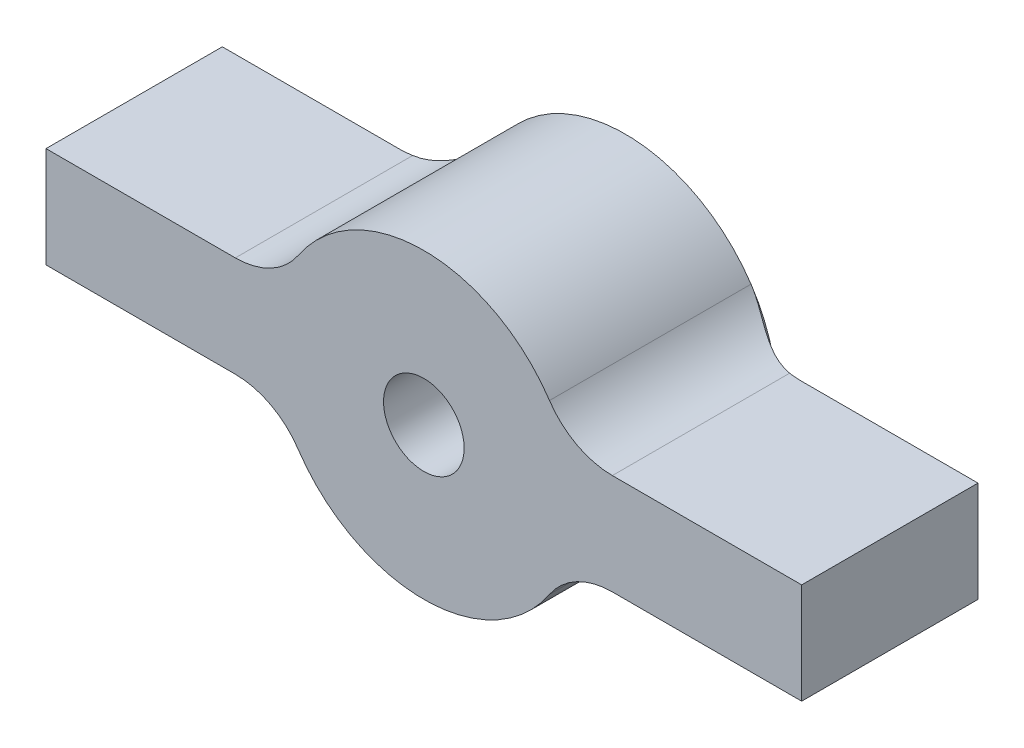
ISO-10303-21;
HEADER;
FILE_DESCRIPTION(('STEP AP214'),'2;1');
FILE_NAME('part.step','',(''),(''),'','','');
FILE_SCHEMA(('AUTOMOTIVE_DESIGN { 1 0 10303 214 1 1 1 1 }'));
ENDSEC;
DATA;
#1=APPLICATION_CONTEXT('core data for automotive mechanical design processes');
#2=APPLICATION_PROTOCOL_DEFINITION('international standard','automotive_design',2000,#1);
#3=PRODUCT_CONTEXT('',#1,'mechanical');
#4=PRODUCT('Part','Part','',(#3));
#5=PRODUCT_RELATED_PRODUCT_CATEGORY('part','',(#4));
#6=PRODUCT_DEFINITION_FORMATION('','',#4);
#7=PRODUCT_DEFINITION_CONTEXT('part definition',#1,'design');
#8=PRODUCT_DEFINITION('design','',#6,#7);
#9=PRODUCT_DEFINITION_SHAPE('','',#8);
#10=(LENGTH_UNIT() NAMED_UNIT(*) SI_UNIT(.MILLI.,.METRE.));
#11=(NAMED_UNIT(*) PLANE_ANGLE_UNIT() SI_UNIT($,.RADIAN.));
#12=(NAMED_UNIT(*) SI_UNIT($,.STERADIAN.) SOLID_ANGLE_UNIT());
#13=UNCERTAINTY_MEASURE_WITH_UNIT(LENGTH_MEASURE(1.E-05),#10,'distance_accuracy_value','');
#14=(GEOMETRIC_REPRESENTATION_CONTEXT(3) GLOBAL_UNCERTAINTY_ASSIGNED_CONTEXT((#13)) GLOBAL_UNIT_ASSIGNED_CONTEXT((#10,
#11,#12)) REPRESENTATION_CONTEXT('',''));
#15=CARTESIAN_POINT('',(0.,0.,0.));
#16=DIRECTION('',(0.,0.,1.));
#17=DIRECTION('',(1.,0.,0.));
#18=AXIS2_PLACEMENT_3D('',#15,#16,#17);
#19=CARTESIAN_POINT('',(4.50028563205647E-11,0.,9.70144103940029E-12));
#20=DIRECTION('',(0.,0.,-1.));
#21=DIRECTION('',(-1.,0.,0.));
#22=AXIS2_PLACEMENT_3D('',#19,#20,#21);
#23=CYLINDRICAL_SURFACE('',#22,6.00000000002839);
#24=CARTESIAN_POINT('',(4.50025882387273E-11,0.,-2.18905432588434));
#25=DIRECTION('',(0.,0.,-1.));
#26=DIRECTION('',(-1.,0.,0.));
#27=AXIS2_PLACEMENT_3D('',#24,#25,#26);
#28=CIRCLE('',#27,6.00000000002839);
#29=CARTESIAN_POINT('',(4.98887651577422,-3.33333333333859,-2.18905432588434));
#30=VERTEX_POINT('',#29);
#31=CARTESIAN_POINT('',(-4.98887651568421,-3.33333333333859,-2.18905432588434));
#32=VERTEX_POINT('',#31);
#33=EDGE_CURVE('E418',#30,#32,#28,.T.);
#34=ORIENTED_EDGE('',*,*,#33,.F.);
#35=DIRECTION('',(0.,0.,-1.));
#36=VECTOR('',#35,1.);
#37=CARTESIAN_POINT('',(4.98887651577422,-3.33333333333859,9.70083007823466E-12));
#38=LINE('',#37,#36);
#39=CARTESIAN_POINT('',(4.98887651577422,-3.33333333333859,5.81094567411566));
#40=VERTEX_POINT('',#39);
#41=EDGE_CURVE('E271',#30,#40,#38,.F.);
#42=ORIENTED_EDGE('',*,*,#41,.T.);
#43=CARTESIAN_POINT('',(4.50035679561667E-11,0.,5.81094567411566));
#44=DIRECTION('',(0.,0.,-1.));
#45=DIRECTION('',(-1.,0.,0.));
#46=AXIS2_PLACEMENT_3D('',#43,#44,#45);
#47=CIRCLE('',#46,6.00000000002839);
#48=CARTESIAN_POINT('',(-4.98887651568421,-3.33333333333859,5.81094567411566));
#49=VERTEX_POINT('',#48);
#50=EDGE_CURVE('E250',#40,#49,#47,.T.);
#51=ORIENTED_EDGE('',*,*,#50,.T.);
#52=DIRECTION('',(0.,0.,-1.));
#53=VECTOR('',#52,1.);
#54=CARTESIAN_POINT('',(-4.98887651568422,-3.33333333333859,9.70205200056593E-12));
#55=LINE('',#54,#53);
#56=EDGE_CURVE('E269',#49,#32,#55,.T.);
#57=ORIENTED_EDGE('',*,*,#56,.T.);
#58=EDGE_LOOP('',(#34,#42,#51,#57));
#59=FACE_BOUND('',#58,.T.);
#60=ADVANCED_FACE('F32',(#59),#23,.T.);
#61=CARTESIAN_POINT('',(4.50030637755283E-11,0.,31.5738213201296));
#62=DIRECTION('',(0.,0.,-1.));
#63=DIRECTION('',(1.,0.,0.));
#64=AXIS2_PLACEMENT_3D('',#61,#62,#63);
#65=SPHERICAL_SURFACE('',#64,34.2918615984689);
#66=CARTESIAN_POINT('',(1.42500000003571,2.46817240076956,31.5738213201296));
#67=DIRECTION('',(0.5,0.866025403784439,0.));
#68=DIRECTION('',(-0.866025403784439,0.5,0.));
#69=AXIS2_PLACEMENT_3D('',#66,#67,#68);
#70=CIRCLE('',#69,34.173224487728);
#71=CARTESIAN_POINT('',(1.86027408755063E-12,3.29089653438432,-2.55976583224159));
#72=VERTEX_POINT('',#71);
#73=CARTESIAN_POINT('',(2.85000000000187,1.64544826719388,-2.55976583224536));
#74=VERTEX_POINT('',#73);
#75=EDGE_CURVE('E11',#72,#74,#70,.F.);
#76=ORIENTED_EDGE('',*,*,#75,.F.);
#77=CARTESIAN_POINT('',(-1.42499999996728,2.46817240080692,31.5738213201296));
#78=DIRECTION('',(-0.5,0.866025403784438,0.));
#79=DIRECTION('',(-0.866025403784439,-0.5,0.));
#80=AXIS2_PLACEMENT_3D('',#77,#78,#79);
#81=CIRCLE('',#80,34.1732244877244);
#82=CARTESIAN_POINT('',(-2.84999999999815,1.64544826719388,-2.55976583223815));
#83=VERTEX_POINT('',#82);
#84=EDGE_CURVE('E173',#83,#72,#81,.F.);
#85=ORIENTED_EDGE('',*,*,#84,.F.);
#86=CARTESIAN_POINT('',(-2.84999999999815,0.,31.5738213201296));
#87=DIRECTION('',(-1.,0.,0.));
#88=DIRECTION('',(0.,0.,1.));
#89=AXIS2_PLACEMENT_3D('',#86,#87,#88);
#90=CIRCLE('',#89,34.1732244877228);
#91=CARTESIAN_POINT('',(-2.84999999999815,-1.645448267187,-2.55976583223849));
#92=VERTEX_POINT('',#91);
#93=EDGE_CURVE('E355',#92,#83,#90,.F.);
#94=ORIENTED_EDGE('',*,*,#93,.F.);
#95=CARTESIAN_POINT('',(-1.4249999999643,-2.46817240080176,31.5738213201296));
#96=DIRECTION('',(-0.5,-0.866025403784439,0.));
#97=DIRECTION('',(0.866025403784439,-0.5,0.));
#98=AXIS2_PLACEMENT_3D('',#95,#96,#97);
#99=CIRCLE('',#98,34.1732244877249);
#100=CARTESIAN_POINT('',(1.85832252364015E-12,-3.29089653437743,-2.55976583224225));
#101=VERTEX_POINT('',#100);
#102=EDGE_CURVE('E358',#101,#92,#99,.F.);
#103=ORIENTED_EDGE('',*,*,#102,.F.);
#104=CARTESIAN_POINT('',(1.42500000003273,-2.46817240076439,31.5738213201296));
#105=DIRECTION('',(0.5,-0.866025403784439,0.));
#106=DIRECTION('',(0.866025403784439,0.5,0.));
#107=AXIS2_PLACEMENT_3D('',#104,#105,#106);
#108=CIRCLE('',#107,34.1732244877285);
#109=CARTESIAN_POINT('',(2.85000000000187,-1.645448267187,-2.55976583224569));
#110=VERTEX_POINT('',#109);
#111=EDGE_CURVE('E360',#110,#101,#108,.F.);
#112=ORIENTED_EDGE('',*,*,#111,.F.);
#113=CARTESIAN_POINT('',(2.85000000000187,0.,31.5738213201296));
#114=DIRECTION('',(1.,0.,0.));
#115=DIRECTION('',(0.,1.,0.));
#116=AXIS2_PLACEMENT_3D('',#113,#114,#115);
#117=CIRCLE('',#116,34.17322448773);
#118=EDGE_CURVE('E41',#74,#110,#117,.F.);
#119=ORIENTED_EDGE('',*,*,#118,.F.);
#120=EDGE_LOOP('',(#76,#85,#94,#103,#112,#119));
#121=FACE_BOUND('',#120,.T.);
#122=CARTESIAN_POINT('',(-4.98887651568421,3.33333333333859,-2.18905432588434));
#123=VERTEX_POINT('',#122);
#124=CARTESIAN_POINT('',(4.98887651577422,3.33333333333859,-2.18905432588434));
#125=VERTEX_POINT('',#124);
#126=EDGE_CURVE('E260',#123,#125,#28,.T.);
#127=ORIENTED_EDGE('',*,*,#126,.T.);
#128=EDGE_CURVE('E264',#125,#30,#28,.T.);
#129=ORIENTED_EDGE('',*,*,#128,.T.);
#130=ORIENTED_EDGE('',*,*,#33,.T.);
#131=EDGE_CURVE('E265',#32,#123,#28,.T.);
#132=ORIENTED_EDGE('',*,*,#131,.T.);
#133=EDGE_LOOP('',(#127,#129,#130,#132));
#134=FACE_BOUND('',#133,.T.);
#135=ADVANCED_FACE('F372',(#121,#134),#65,.T.);
#136=ORIENTED_EDGE('',*,*,#126,.F.);
#137=DIRECTION('',(0.,0.,-1.));
#138=VECTOR('',#137,1.);
#139=CARTESIAN_POINT('',(-4.98887651568422,3.33333333333859,9.70205200056593E-12));
#140=LINE('',#139,#138);
#141=CARTESIAN_POINT('',(-4.98887651568421,3.33333333333859,5.81094567411566));
#142=VERTEX_POINT('',#141);
#143=EDGE_CURVE('E267',#123,#142,#140,.F.);
#144=ORIENTED_EDGE('',*,*,#143,.T.);
#145=CARTESIAN_POINT('',(4.98887651577422,3.33333333333859,5.81094567411566));
#146=VERTEX_POINT('',#145);
#147=EDGE_CURVE('E259',#142,#146,#47,.T.);
#148=ORIENTED_EDGE('',*,*,#147,.T.);
#149=DIRECTION('',(0.,0.,-1.));
#150=VECTOR('',#149,1.);
#151=CARTESIAN_POINT('',(4.98887651577422,3.33333333333859,9.70083007823466E-12));
#152=LINE('',#151,#150);
#153=EDGE_CURVE('E263',#146,#125,#152,.T.);
#154=ORIENTED_EDGE('',*,*,#153,.T.);
#155=EDGE_LOOP('',(#136,#144,#148,#154));
#156=FACE_BOUND('',#155,.T.);
#157=ADVANCED_FACE('F391',(#156),#23,.T.);
#158=CARTESIAN_POINT('',(-5.99999999998338,0.,5.81094567411566));
#159=DIRECTION('',(0.,0.,1.));
#160=DIRECTION('',(1.,0.,0.));
#161=AXIS2_PLACEMENT_3D('',#158,#159,#160);
#162=PLANE('',#161);
#163=CARTESIAN_POINT('',(1.85968103745964E-12,3.44170202478376E-12,5.81094567411566));
#164=DIRECTION('',(0.,0.,1.));
#165=DIRECTION('',(1.,0.,0.));
#166=AXIS2_PLACEMENT_3D('',#163,#164,#165);
#167=CIRCLE('',#166,1.59999999999999);
#168=CARTESIAN_POINT('',(1.60000000000185,3.44170202478376E-12,5.81094567411566));
#169=VERTEX_POINT('',#168);
#170=EDGE_CURVE('E193',#169,#169,#167,.T.);
#171=ORIENTED_EDGE('',*,*,#170,.F.);
#172=EDGE_LOOP('',(#171));
#173=FACE_BOUND('',#172,.T.);
#174=ORIENTED_EDGE('',*,*,#147,.F.);
#175=CARTESIAN_POINT('',(-7.48331477353702,5.,5.81094567411566));
#176=DIRECTION('',(0.,0.,1.));
#177=DIRECTION('',(1.,0.,0.));
#178=AXIS2_PLACEMENT_3D('',#175,#176,#177);
#179=CIRCLE('',#178,3.);
#180=CARTESIAN_POINT('',(-7.48331477353702,2.,5.81094567411566));
#181=VERTEX_POINT('',#180);
#182=EDGE_CURVE('E422',#142,#181,#179,.F.);
#183=ORIENTED_EDGE('',*,*,#182,.T.);
#184=DIRECTION('',(-1.,0.,0.));
#185=VECTOR('',#184,1.);
#186=CARTESIAN_POINT('',(-15.,2.,5.81094567411566));
#187=LINE('',#186,#185);
#188=CARTESIAN_POINT('',(-15.,2.,5.81094567411566));
#189=VERTEX_POINT('',#188);
#190=EDGE_CURVE('E236',#181,#189,#187,.T.);
#191=ORIENTED_EDGE('',*,*,#190,.T.);
#192=DIRECTION('',(0.,-1.,0.));
#193=VECTOR('',#192,1.);
#194=CARTESIAN_POINT('',(-15.,2.,5.81094567411566));
#195=LINE('',#194,#193);
#196=CARTESIAN_POINT('',(-15.,-2.,5.81094567411566));
#197=VERTEX_POINT('',#196);
#198=EDGE_CURVE('E241',#189,#197,#195,.T.);
#199=ORIENTED_EDGE('',*,*,#198,.T.);
#200=DIRECTION('',(1.,0.,0.));
#201=VECTOR('',#200,1.);
#202=CARTESIAN_POINT('',(-15.,-2.,5.81094567411566));
#203=LINE('',#202,#201);
#204=CARTESIAN_POINT('',(-7.48331477353702,-2.,5.81094567411566));
#205=VERTEX_POINT('',#204);
#206=EDGE_CURVE('E221',#197,#205,#203,.T.);
#207=ORIENTED_EDGE('',*,*,#206,.T.);
#208=CARTESIAN_POINT('',(-7.48331477353702,-5.,5.81094567411566));
#209=DIRECTION('',(0.,0.,1.));
#210=DIRECTION('',(1.,0.,0.));
#211=AXIS2_PLACEMENT_3D('',#208,#209,#210);
#212=CIRCLE('',#211,3.);
#213=EDGE_CURVE('E428',#205,#49,#212,.F.);
#214=ORIENTED_EDGE('',*,*,#213,.T.);
#215=ORIENTED_EDGE('',*,*,#50,.F.);
#216=CARTESIAN_POINT('',(7.48331477362703,-5.,5.81094567411566));
#217=DIRECTION('',(0.,0.,1.));
#218=DIRECTION('',(1.,0.,0.));
#219=AXIS2_PLACEMENT_3D('',#216,#217,#218);
#220=CIRCLE('',#219,3.);
#221=CARTESIAN_POINT('',(7.48331477362703,-2.,5.81094567411566));
#222=VERTEX_POINT('',#221);
#223=EDGE_CURVE('E322',#40,#222,#220,.F.);
#224=ORIENTED_EDGE('',*,*,#223,.T.);
#225=CARTESIAN_POINT('',(15.,-2.,5.81094567411566));
#226=VERTEX_POINT('',#225);
#227=EDGE_CURVE('E244',#222,#226,#203,.T.);
#228=ORIENTED_EDGE('',*,*,#227,.T.);
#229=DIRECTION('',(0.,1.,0.));
#230=VECTOR('',#229,1.);
#231=CARTESIAN_POINT('',(15.,2.,5.81094567411566));
#232=LINE('',#231,#230);
#233=CARTESIAN_POINT('',(15.,2.,5.81094567411566));
#234=VERTEX_POINT('',#233);
#235=EDGE_CURVE('E233',#226,#234,#232,.T.);
#236=ORIENTED_EDGE('',*,*,#235,.T.);
#237=CARTESIAN_POINT('',(7.48331477362703,2.,5.81094567411566));
#238=VERTEX_POINT('',#237);
#239=EDGE_CURVE('E238',#234,#238,#187,.T.);
#240=ORIENTED_EDGE('',*,*,#239,.T.);
#241=CARTESIAN_POINT('',(7.48331477362703,5.,5.81094567411566));
#242=DIRECTION('',(0.,0.,1.));
#243=DIRECTION('',(1.,0.,0.));
#244=AXIS2_PLACEMENT_3D('',#241,#242,#243);
#245=CIRCLE('',#244,3.);
#246=EDGE_CURVE('E356',#238,#146,#245,.F.);
#247=ORIENTED_EDGE('',*,*,#246,.T.);
#248=EDGE_LOOP('',(#174,#183,#191,#199,#207,#214,#215,#224,#228,#236,#240,#247));
#249=FACE_BOUND('',#248,.T.);
#250=ADVANCED_FACE('F398',(#173,#249),#162,.T.);
#251=CARTESIAN_POINT('',(15.,2.,-1.18905432588434));
#252=DIRECTION('',(1.,0.,0.));
#253=DIRECTION('',(0.,0.,-1.));
#254=AXIS2_PLACEMENT_3D('',#251,#252,#253);
#255=PLANE('',#254);
#256=ORIENTED_EDGE('',*,*,#235,.F.);
#257=DIRECTION('',(0.,0.,1.));
#258=VECTOR('',#257,1.);
#259=CARTESIAN_POINT('',(15.,-2.,-1.18905432588434));
#260=LINE('',#259,#258);
#261=CARTESIAN_POINT('',(15.,-2.,-1.18905432588434));
#262=VERTEX_POINT('',#261);
#263=EDGE_CURVE('E247',#262,#226,#260,.T.);
#264=ORIENTED_EDGE('',*,*,#263,.F.);
#265=DIRECTION('',(0.,1.,0.));
#266=VECTOR('',#265,1.);
#267=CARTESIAN_POINT('',(15.,2.,-1.18905432588434));
#268=LINE('',#267,#266);
#269=CARTESIAN_POINT('',(15.,2.,-1.18905432588434));
#270=VERTEX_POINT('',#269);
#271=EDGE_CURVE('E217',#262,#270,#268,.T.);
#272=ORIENTED_EDGE('',*,*,#271,.T.);
#273=DIRECTION('',(0.,0.,1.));
#274=VECTOR('',#273,1.);
#275=CARTESIAN_POINT('',(15.,2.,-1.18905432588434));
#276=LINE('',#275,#274);
#277=EDGE_CURVE('E232',#270,#234,#276,.T.);
#278=ORIENTED_EDGE('',*,*,#277,.T.);
#279=EDGE_LOOP('',(#256,#264,#272,#278));
#280=FACE_BOUND('',#279,.T.);
#281=ADVANCED_FACE('F312',(#280),#255,.T.);
#282=CARTESIAN_POINT('',(0.,0.,-1.18905432588434));
#283=DIRECTION('',(0.,0.,1.));
#284=DIRECTION('',(1.,0.,0.));
#285=AXIS2_PLACEMENT_3D('',#282,#283,#284);
#286=PLANE('',#285);
#287=DIRECTION('',(1.,0.,0.));
#288=VECTOR('',#287,1.);
#289=CARTESIAN_POINT('',(-15.,-2.,-1.18905432588434));
#290=LINE('',#289,#288);
#291=CARTESIAN_POINT('',(7.98954415039959,-2.,-1.18905432588434));
#292=VERTEX_POINT('',#291);
#293=EDGE_CURVE('E228',#292,#262,#290,.T.);
#294=ORIENTED_EDGE('',*,*,#293,.F.);
#295=CARTESIAN_POINT('',(4.50025882387273E-11,0.,-1.18905432588434));
#296=DIRECTION('',(0.,0.,1.));
#297=DIRECTION('',(1.,0.,0.));
#298=AXIS2_PLACEMENT_3D('',#295,#296,#297);
#299=CIRCLE('',#298,8.23606797752818);
#300=CARTESIAN_POINT('',(7.98954415039959,2.,-1.18905432588434));
#301=VERTEX_POINT('',#300);
#302=EDGE_CURVE('E275',#292,#301,#299,.T.);
#303=ORIENTED_EDGE('',*,*,#302,.T.);
#304=DIRECTION('',(-1.,0.,0.));
#305=VECTOR('',#304,1.);
#306=CARTESIAN_POINT('',(-15.,2.,-1.18905432588434));
#307=LINE('',#306,#305);
#308=EDGE_CURVE('E222',#270,#301,#307,.T.);
#309=ORIENTED_EDGE('',*,*,#308,.F.);
#310=ORIENTED_EDGE('',*,*,#271,.F.);
#311=EDGE_LOOP('',(#294,#303,#309,#310));
#312=FACE_BOUND('',#311,.T.);
#313=ADVANCED_FACE('F486',(#312),#286,.F.);
#314=CARTESIAN_POINT('',(-15.,2.,-1.18905432588434));
#315=DIRECTION('',(0.,1.,0.));
#316=DIRECTION('',(0.,0.,1.));
#317=AXIS2_PLACEMENT_3D('',#314,#315,#316);
#318=PLANE('',#317);
#319=CARTESIAN_POINT('',(7.98954415039959,2.,-1.18905432588434));
#320=CARTESIAN_POINT('',(7.90463926591436,2.,-1.18907651829435));
#321=CARTESIAN_POINT('',(7.82000090337679,2.,-1.19244629891073));
#322=CARTESIAN_POINT('',(7.65125778131834,2.,-1.20588099204109));
#323=CARTESIAN_POINT('',(7.56715301826505,2.,-1.21594586018714));
#324=CARTESIAN_POINT('',(7.48331477362703,2.,-1.22935827217164));
#325=B_SPLINE_CURVE_WITH_KNOTS('',3,(#319,#320,#321,#322,#323,#324),.UNSPECIFIED.,.F.,.F.,(4,2,
4),(0.,0.254116253927189,0.508230823858594),.UNSPECIFIED.);
#326=CARTESIAN_POINT('',(7.48331477362703,2.,-1.22935827217164));
#327=VERTEX_POINT('',#326);
#328=EDGE_CURVE('E316',#301,#327,#325,.T.);
#329=ORIENTED_EDGE('',*,*,#328,.T.);
#330=DIRECTION('',(0.,0.,1.));
#331=VECTOR('',#330,1.);
#332=CARTESIAN_POINT('',(7.48331477362703,2.,5.81094567411566));
#333=LINE('',#332,#331);
#334=EDGE_CURVE('E56',#327,#238,#333,.T.);
#335=ORIENTED_EDGE('',*,*,#334,.T.);
#336=ORIENTED_EDGE('',*,*,#239,.F.);
#337=ORIENTED_EDGE('',*,*,#277,.F.);
#338=ORIENTED_EDGE('',*,*,#308,.T.);
#339=EDGE_LOOP('',(#329,#335,#336,#337,#338));
#340=FACE_BOUND('',#339,.T.);
#341=ADVANCED_FACE('F311',(#340),#318,.T.);
#342=CARTESIAN_POINT('',(-15.,-2.,-1.18905432588434));
#343=DIRECTION('',(0.,-1.,0.));
#344=DIRECTION('',(0.,0.,-1.));
#345=AXIS2_PLACEMENT_3D('',#342,#343,#344);
#346=PLANE('',#345);
#347=ORIENTED_EDGE('',*,*,#227,.F.);
#348=DIRECTION('',(0.,0.,1.));
#349=VECTOR('',#348,1.);
#350=CARTESIAN_POINT('',(7.48331477362703,-2.,-1.18905432588434));
#351=LINE('',#350,#349);
#352=CARTESIAN_POINT('',(7.48331477362703,-2.,-1.22935827217164));
#353=VERTEX_POINT('',#352);
#354=EDGE_CURVE('E277',#222,#353,#351,.F.);
#355=ORIENTED_EDGE('',*,*,#354,.T.);
#356=CARTESIAN_POINT('',(7.48331477362703,-2.,-1.22935827217164));
#357=CARTESIAN_POINT('',(7.56715301826505,-2.,-1.21594586018714));
#358=CARTESIAN_POINT('',(7.65125778131834,-2.,-1.20588099204109));
#359=CARTESIAN_POINT('',(7.82000090337679,-2.,-1.19244629891073));
#360=CARTESIAN_POINT('',(7.90463926591436,-2.,-1.18907651829435));
#361=CARTESIAN_POINT('',(7.98954415039959,-2.,-1.18905432588434));
#362=B_SPLINE_CURVE_WITH_KNOTS('',3,(#356,#357,#358,#359,#360,#361),.UNSPECIFIED.,.F.,.F.,(4,2,
4),(0.,0.254114569931405,0.508230823858594),.UNSPECIFIED.);
#363=EDGE_CURVE('E323',#353,#292,#362,.T.);
#364=ORIENTED_EDGE('',*,*,#363,.T.);
#365=ORIENTED_EDGE('',*,*,#293,.T.);
#366=ORIENTED_EDGE('',*,*,#263,.T.);
#367=EDGE_LOOP('',(#347,#355,#364,#365,#366));
#368=FACE_BOUND('',#367,.T.);
#369=ADVANCED_FACE('F475',(#368),#346,.T.);
#370=CARTESIAN_POINT('',(-7.98954415030958,2.,-1.18905432588434));
#371=VERTEX_POINT('',#370);
#372=CARTESIAN_POINT('',(-15.,2.,-1.18905432588434));
#373=VERTEX_POINT('',#372);
#374=EDGE_CURVE('E220',#371,#373,#307,.T.);
#375=ORIENTED_EDGE('',*,*,#374,.F.);
#376=CARTESIAN_POINT('',(4.50025882387273E-11,0.,-1.18905432588434));
#377=DIRECTION('',(0.,0.,1.));
#378=DIRECTION('',(1.,0.,0.));
#379=AXIS2_PLACEMENT_3D('',#376,#377,#378);
#380=CIRCLE('',#379,8.23606797752818);
#381=CARTESIAN_POINT('',(-7.98954415030958,-2.,-1.18905432588434));
#382=VERTEX_POINT('',#381);
#383=EDGE_CURVE('E273',#371,#382,#380,.T.);
#384=ORIENTED_EDGE('',*,*,#383,.T.);
#385=CARTESIAN_POINT('',(-15.,-2.,-1.18905432588434));
#386=VERTEX_POINT('',#385);
#387=EDGE_CURVE('E229',#386,#382,#290,.T.);
#388=ORIENTED_EDGE('',*,*,#387,.F.);
#389=DIRECTION('',(0.,-1.,0.));
#390=VECTOR('',#389,1.);
#391=CARTESIAN_POINT('',(-15.,2.,-1.18905432588434));
#392=LINE('',#391,#390);
#393=EDGE_CURVE('E225',#373,#386,#392,.T.);
#394=ORIENTED_EDGE('',*,*,#393,.F.);
#395=EDGE_LOOP('',(#375,#384,#388,#394));
#396=FACE_BOUND('',#395,.T.);
#397=ADVANCED_FACE('F466',(#396),#286,.F.);
#398=CARTESIAN_POINT('',(-7.98954415030958,-2.,-1.18905432588434));
#399=CARTESIAN_POINT('',(-7.90463926582435,-2.,-1.18907651829435));
#400=CARTESIAN_POINT('',(-7.82000090328678,-2.,-1.19244629891073));
#401=CARTESIAN_POINT('',(-7.65125778122833,-2.,-1.20588099204109));
#402=CARTESIAN_POINT('',(-7.56715301817504,-2.,-1.21594586018714));
#403=CARTESIAN_POINT('',(-7.48331477353702,-2.,-1.22935827217164));
#404=B_SPLINE_CURVE_WITH_KNOTS('',3,(#398,#399,#400,#401,#402,#403),.UNSPECIFIED.,.F.,.F.,(4,2,
4),(0.,0.254116253927189,0.508230823858595),.UNSPECIFIED.);
#405=CARTESIAN_POINT('',(-7.48331477353702,-2.,-1.22935827217164));
#406=VERTEX_POINT('',#405);
#407=EDGE_CURVE('E292',#382,#406,#404,.T.);
#408=ORIENTED_EDGE('',*,*,#407,.T.);
#409=DIRECTION('',(0.,0.,1.));
#410=VECTOR('',#409,1.);
#411=CARTESIAN_POINT('',(-7.48331477353702,-2.,5.81094567411566));
#412=LINE('',#411,#410);
#413=EDGE_CURVE('E279',#406,#205,#412,.T.);
#414=ORIENTED_EDGE('',*,*,#413,.T.);
#415=ORIENTED_EDGE('',*,*,#206,.F.);
#416=DIRECTION('',(0.,0.,1.));
#417=VECTOR('',#416,1.);
#418=CARTESIAN_POINT('',(-15.,-2.,-1.18905432588434));
#419=LINE('',#418,#417);
#420=EDGE_CURVE('E251',#386,#197,#419,.T.);
#421=ORIENTED_EDGE('',*,*,#420,.F.);
#422=ORIENTED_EDGE('',*,*,#387,.T.);
#423=EDGE_LOOP('',(#408,#414,#415,#421,#422));
#424=FACE_BOUND('',#423,.T.);
#425=ADVANCED_FACE('F458',(#424),#346,.T.);
#426=CARTESIAN_POINT('',(-15.,2.,-1.18905432588434));
#427=DIRECTION('',(-1.,0.,0.));
#428=DIRECTION('',(0.,0.,1.));
#429=AXIS2_PLACEMENT_3D('',#426,#427,#428);
#430=PLANE('',#429);
#431=ORIENTED_EDGE('',*,*,#198,.F.);
#432=DIRECTION('',(0.,0.,1.));
#433=VECTOR('',#432,1.);
#434=CARTESIAN_POINT('',(-15.,2.,-1.18905432588434));
#435=LINE('',#434,#433);
#436=EDGE_CURVE('E253',#373,#189,#435,.T.);
#437=ORIENTED_EDGE('',*,*,#436,.F.);
#438=ORIENTED_EDGE('',*,*,#393,.T.);
#439=ORIENTED_EDGE('',*,*,#420,.T.);
#440=EDGE_LOOP('',(#431,#437,#438,#439));
#441=FACE_BOUND('',#440,.T.);
#442=ADVANCED_FACE('F309',(#441),#430,.T.);
#443=ORIENTED_EDGE('',*,*,#190,.F.);
#444=DIRECTION('',(0.,0.,1.));
#445=VECTOR('',#444,1.);
#446=CARTESIAN_POINT('',(-7.48331477353702,2.,-1.18905432588434));
#447=LINE('',#446,#445);
#448=CARTESIAN_POINT('',(-7.48331477353702,2.,-1.22935827217164));
#449=VERTEX_POINT('',#448);
#450=EDGE_CURVE('E281',#181,#449,#447,.F.);
#451=ORIENTED_EDGE('',*,*,#450,.T.);
#452=CARTESIAN_POINT('',(-7.48331477353702,2.,-1.22935827217164));
#453=CARTESIAN_POINT('',(-7.56715301817504,2.,-1.21594586018714));
#454=CARTESIAN_POINT('',(-7.65125778122833,2.,-1.20588099204109));
#455=CARTESIAN_POINT('',(-7.82000090328678,2.,-1.19244629891073));
#456=CARTESIAN_POINT('',(-7.90463926582435,2.,-1.18907651829435));
#457=CARTESIAN_POINT('',(-7.98954415030958,2.,-1.18905432588434));
#458=B_SPLINE_CURVE_WITH_KNOTS('',3,(#452,#453,#454,#455,#456,#457),.UNSPECIFIED.,.F.,.F.,(4,2,
4),(0.,0.254114569931406,0.508230823858595),.UNSPECIFIED.);
#459=EDGE_CURVE('E284',#449,#371,#458,.T.);
#460=ORIENTED_EDGE('',*,*,#459,.T.);
#461=ORIENTED_EDGE('',*,*,#374,.T.);
#462=ORIENTED_EDGE('',*,*,#436,.T.);
#463=EDGE_LOOP('',(#443,#451,#460,#461,#462));
#464=FACE_BOUND('',#463,.T.);
#465=ADVANCED_FACE('F303',(#464),#318,.T.);
#466=CARTESIAN_POINT('',(-7.48331477353702,-5.,9.70235748114874E-12));
#467=DIRECTION('',(0.,0.,-1.));
#468=DIRECTION('',(-1.,0.,0.));
#469=AXIS2_PLACEMENT_3D('',#466,#467,#468);
#470=CYLINDRICAL_SURFACE('',#469,3.);
#471=ORIENTED_EDGE('',*,*,#413,.F.);
#472=CARTESIAN_POINT('',(-7.48331477353702,-2.,-1.22935827217164));
#473=CARTESIAN_POINT('',(-7.40252428029329,-1.99998528041609,-1.24225526668067));
#474=CARTESIAN_POINT('',(-7.32228097570668,-2.00326221387836,-1.25813636005146));
#475=CARTESIAN_POINT('',(-7.16366629128785,-2.01602339016115,-1.29507015828923));
#476=CARTESIAN_POINT('',(-7.0852912949451,-2.02549442351029,-1.31611179828094));
#477=CARTESIAN_POINT('',(-6.93159546762835,-2.0501499987918,-1.3624044874245));
#478=CARTESIAN_POINT('',(-6.85625230153677,-2.06527790456696,-1.38761247176683));
#479=CARTESIAN_POINT('',(-6.70810985398774,-2.10088577917433,-1.44156043637761));
#480=CARTESIAN_POINT('',(-6.63531201650296,-2.12136873183013,-1.47030238101873));
#481=CARTESIAN_POINT('',(-6.47691476957147,-2.17236639693799,-1.53698909544971));
#482=CARTESIAN_POINT('',(-6.39197690192773,-2.20409416948592,-1.57557544013899));
#483=CARTESIAN_POINT('',(-6.22617979727403,-2.27461293050025,-1.65502004738099));
#484=CARTESIAN_POINT('',(-6.1453222637728,-2.31340683837443,-1.69587924410883));
#485=CARTESIAN_POINT('',(-5.98722393217182,-2.39811779362813,-1.7781445664839));
#486=CARTESIAN_POINT('',(-5.90999869372143,-2.44406239129128,-1.81955221562458));
#487=CARTESIAN_POINT('',(-5.75932600969566,-2.54317581622154,-1.90041261383456));
#488=CARTESIAN_POINT('',(-5.68587568140457,-2.59633901450336,-1.93986685375785));
#489=CARTESIAN_POINT('',(-5.53403317505383,-2.71727566752311,-2.01829406610524));
#490=CARTESIAN_POINT('',(-5.45609295096257,-2.78603488373758,-2.05665113178724));
#491=CARTESIAN_POINT('',(-5.30578096396708,-2.93377447288368,-2.12127426864134));
#492=CARTESIAN_POINT('',(-5.2333710959189,-3.01267245560575,-2.14763076911654));
#493=CARTESIAN_POINT('',(-5.13377230927342,-3.1339820367114,-2.17284834022956));
#494=CARTESIAN_POINT('',(-5.10365217187415,-3.17254147617808,-2.17885745136111));
#495=CARTESIAN_POINT('',(-5.04496842906277,-3.25159638881162,-2.18699020017215));
#496=CARTESIAN_POINT('',(-5.01641576776656,-3.2921024854397,-2.18908923857048));
#497=CARTESIAN_POINT('',(-4.98887651568421,-3.33333333333859,-2.18905432588435));
#498=B_SPLINE_CURVE_WITH_KNOTS('',3,(#472,#473,#474,#475,#476,#477,#478,#479,#480,#481,#482,
#483,#484,#485,#486,#487,#488,#489,#490,#491,#492,#493,#494,#495,#496,#497),.UNSPECIFIED.,.F.,
.F.,(4,2,2,2,2,2,2,2,2,2,2,2,4),(0.,0.245217232434344,0.489913215004309,0.732222204144409,
0.974666496290397,1.26986928243601,1.56519431082703,1.86168670337655,2.1579492081736,
2.48946468258872,2.81843893546251,2.9661310979232,3.11474933226819),.UNSPECIFIED.);
#499=EDGE_CURVE('E237',#32,#406,#498,.F.);
#500=ORIENTED_EDGE('',*,*,#499,.F.);
#501=ORIENTED_EDGE('',*,*,#56,.F.);
#502=ORIENTED_EDGE('',*,*,#213,.F.);
#503=EDGE_LOOP('',(#471,#500,#501,#502));
#504=FACE_BOUND('',#503,.T.);
#505=ADVANCED_FACE('F308',(#504),#470,.F.);
#506=CARTESIAN_POINT('',(-7.48331477353702,5.,9.70235748114874E-12));
#507=DIRECTION('',(0.,0.,-1.));
#508=DIRECTION('',(-1.,0.,0.));
#509=AXIS2_PLACEMENT_3D('',#506,#507,#508);
#510=CYLINDRICAL_SURFACE('',#509,3.);
#511=ORIENTED_EDGE('',*,*,#182,.F.);
#512=ORIENTED_EDGE('',*,*,#143,.F.);
#513=CARTESIAN_POINT('',(-4.98887651568421,3.33333333333859,-2.18905432588434));
#514=CARTESIAN_POINT('',(-5.01833175377592,3.28922374030683,-2.18911008823161));
#515=CARTESIAN_POINT('',(-5.04895805129733,3.24594216567084,-2.18669640532906));
#516=CARTESIAN_POINT('',(-5.11211696882919,3.1614757773458,-2.17737456013081));
#517=CARTESIAN_POINT('',(-5.1446441055322,3.12028551654267,-2.17047879613136));
#518=CARTESIAN_POINT('',(-5.21077562798021,3.04086771192998,-2.15278241817545));
#519=CARTESIAN_POINT('',(-5.24435278814311,3.00260205836149,-2.14204925154924));
#520=CARTESIAN_POINT('',(-5.31285070440509,2.92837325852403,-2.1173006727503));
#521=CARTESIAN_POINT('',(-5.34777246833355,2.89241189538873,-2.10328275687946));
#522=CARTESIAN_POINT('',(-5.43741581863631,2.80453879727097,-2.06457931715657));
#523=CARTESIAN_POINT('',(-5.4929011757485,2.75417249778705,-2.03815838680734));
#524=CARTESIAN_POINT('',(-5.60625146588564,2.65860367969297,-1.9814042692785));
#525=CARTESIAN_POINT('',(-5.664117790419,2.61340424076093,-1.95106877153678));
#526=CARTESIAN_POINT('',(-5.78278357930323,2.52742771813257,-1.88793520159719));
#527=CARTESIAN_POINT('',(-5.84360643116031,2.48669890795673,-1.85511570131809));
#528=CARTESIAN_POINT('',(-5.9677527653609,2.40994249041283,-1.78871235393659));
#529=CARTESIAN_POINT('',(-6.03107658675969,2.37391552334095,-1.75512840346132));
#530=CARTESIAN_POINT('',(-6.16625248420807,2.30339539024978,-1.68532380880075));
#531=CARTESIAN_POINT('',(-6.23835540628536,2.26934239842224,-1.64914230599718));
#532=CARTESIAN_POINT('',(-6.38581941743088,2.20680877411951,-1.57857131926542));
#533=CARTESIAN_POINT('',(-6.46118123618292,2.17832939757601,-1.54418224051132));
#534=CARTESIAN_POINT('',(-6.61459381229568,2.12740421934144,-1.47862237057355));
#535=CARTESIAN_POINT('',(-6.69262152182908,2.10491677949622,-1.4474303489675));
#536=CARTESIAN_POINT('',(-6.85162973392168,2.06611761750169,-1.38909357230547));
#537=CARTESIAN_POINT('',(-6.93260815669671,2.04980163435756,-1.36194603267249));
#538=CARTESIAN_POINT('',(-7.09093193687276,2.02477656546884,-1.31456702612518));
#539=CARTESIAN_POINT('',(-7.16808943530962,2.01558583042368,-1.29396796078455));
#540=CARTESIAN_POINT('',(-7.32441966781053,2.00317598734772,-1.25771459739376));
#541=CARTESIAN_POINT('',(-7.4036004133816,1.99998630997296,-1.2420849799986));
#542=CARTESIAN_POINT('',(-7.48331477353702,2.,-1.22935827217164));
#543=B_SPLINE_CURVE_WITH_KNOTS('',3,(#513,#514,#515,#516,#517,#518,#519,#520,#521,#522,#523,
#524,#525,#526,#527,#528,#529,#530,#531,#532,#533,#534,#535,#536,#537,#538,#539,#540,#541,#542),
.UNSPECIFIED.,.F.,.F.,(4,2,2,2,2,2,2,2,2,2,2,2,2,2,4),(0.,0.15898634230403,0.317534758861869,
0.47342341073897,0.629431272641676,0.867397096176111,1.10550402637335,1.34597100049249,
1.58647068726948,1.84892291143347,2.11143420739946,2.37207069232478,2.63252689457063,
2.87330174964039,3.11525437627915),.UNSPECIFIED.);
#544=EDGE_CURVE('E353',#449,#123,#543,.F.);
#545=ORIENTED_EDGE('',*,*,#544,.F.);
#546=ORIENTED_EDGE('',*,*,#450,.F.);
#547=EDGE_LOOP('',(#511,#512,#545,#546));
#548=FACE_BOUND('',#547,.T.);
#549=ADVANCED_FACE('F426',(#548),#510,.F.);
#550=CARTESIAN_POINT('',(4.50025882387273E-11,0.,-4.18905432588434));
#551=DIRECTION('',(0.,0.,1.));
#552=DIRECTION('',(1.,0.,0.));
#553=AXIS2_PLACEMENT_3D('',#550,#551,#552);
#554=TOROIDAL_SURFACE('',#553,8.23606797752818,3.);
#555=ORIENTED_EDGE('',*,*,#407,.F.);
#556=ORIENTED_EDGE('',*,*,#383,.F.);
#557=ORIENTED_EDGE('',*,*,#459,.F.);
#558=ORIENTED_EDGE('',*,*,#544,.T.);
#559=ORIENTED_EDGE('',*,*,#131,.F.);
#560=ORIENTED_EDGE('',*,*,#499,.T.);
#561=EDGE_LOOP('',(#555,#556,#557,#558,#559,#560));
#562=FACE_BOUND('',#561,.T.);
#563=ADVANCED_FACE('F299',(#562),#554,.F.);
#564=CARTESIAN_POINT('',(7.48331477362703,5.,9.70052459765184E-12));
#565=DIRECTION('',(0.,0.,-1.));
#566=DIRECTION('',(-1.,0.,0.));
#567=AXIS2_PLACEMENT_3D('',#564,#565,#566);
#568=CYLINDRICAL_SURFACE('',#567,3.);
#569=ORIENTED_EDGE('',*,*,#334,.F.);
#570=CARTESIAN_POINT('',(7.48331477362703,2.,-1.22935827217164));
#571=CARTESIAN_POINT('',(7.40252428038329,1.99998528041609,-1.24225526668067));
#572=CARTESIAN_POINT('',(7.32228097579668,2.00326221387836,-1.25813636005146));
#573=CARTESIAN_POINT('',(7.16366629137786,2.01602339016115,-1.29507015828923));
#574=CARTESIAN_POINT('',(7.0852912950351,2.02549442351029,-1.31611179828094));
#575=CARTESIAN_POINT('',(6.93159546771836,2.0501499987918,-1.3624044874245));
#576=CARTESIAN_POINT('',(6.85625230162677,2.06527790456696,-1.38761247176682));
#577=CARTESIAN_POINT('',(6.70810985407774,2.10088577917433,-1.44156043637761));
#578=CARTESIAN_POINT('',(6.63531201659296,2.12136873183013,-1.47030238101873));
#579=CARTESIAN_POINT('',(6.47691476966148,2.17236639693799,-1.53698909544971));
#580=CARTESIAN_POINT('',(6.39197690201774,2.20409416948592,-1.57557544013899));
#581=CARTESIAN_POINT('',(6.22617979736404,2.27461293050025,-1.65502004738099));
#582=CARTESIAN_POINT('',(6.14532226386281,2.31340683837443,-1.69587924410883));
#583=CARTESIAN_POINT('',(5.98722393226182,2.39811779362814,-1.7781445664839));
#584=CARTESIAN_POINT('',(5.90999869381143,2.44406239129128,-1.81955221562458));
#585=CARTESIAN_POINT('',(5.75932600978566,2.54317581622154,-1.90041261383456));
#586=CARTESIAN_POINT('',(5.68587568149457,2.59633901450336,-1.93986685375785));
#587=CARTESIAN_POINT('',(5.53403317514384,2.71727566752311,-2.01829406610524));
#588=CARTESIAN_POINT('',(5.45609295105257,2.78603488373758,-2.05665113178724));
#589=CARTESIAN_POINT('',(5.30578096405708,2.93377447288368,-2.12127426864134));
#590=CARTESIAN_POINT('',(5.2333710960089,3.01267245560576,-2.14763076911654));
#591=CARTESIAN_POINT('',(5.13377230936342,3.1339820367114,-2.17284834022956));
#592=CARTESIAN_POINT('',(5.10365217196415,3.17254147617808,-2.17885745136111));
#593=CARTESIAN_POINT('',(5.04496842915277,3.25159638881162,-2.18699020017216));
#594=CARTESIAN_POINT('',(5.01641576785657,3.2921024854397,-2.18908923857048));
#595=CARTESIAN_POINT('',(4.98887651577422,3.33333333333859,-2.18905432588435));
#596=B_SPLINE_CURVE_WITH_KNOTS('',3,(#570,#571,#572,#573,#574,#575,#576,#577,#578,#579,#580,
#581,#582,#583,#584,#585,#586,#587,#588,#589,#590,#591,#592,#593,#594,#595),.UNSPECIFIED.,.F.,
.F.,(4,2,2,2,2,2,2,2,2,2,2,2,4),(0.,0.245217232434344,0.489913215004309,0.732222204144409,
0.974666496290397,1.26986928243601,1.56519431082703,1.86168670337655,2.1579492081736,
2.48946468258872,2.81843893546251,2.9661310979232,3.11474933226819),.UNSPECIFIED.);
#597=EDGE_CURVE('E346',#125,#327,#596,.F.);
#598=ORIENTED_EDGE('',*,*,#597,.F.);
#599=ORIENTED_EDGE('',*,*,#153,.F.);
#600=ORIENTED_EDGE('',*,*,#246,.F.);
#601=EDGE_LOOP('',(#569,#598,#599,#600));
#602=FACE_BOUND('',#601,.T.);
#603=ADVANCED_FACE('F34',(#602),#568,.F.);
#604=CARTESIAN_POINT('',(7.48331477362703,-5.,9.70052459765184E-12));
#605=DIRECTION('',(0.,0.,-1.));
#606=DIRECTION('',(-1.,0.,0.));
#607=AXIS2_PLACEMENT_3D('',#604,#605,#606);
#608=CYLINDRICAL_SURFACE('',#607,3.);
#609=ORIENTED_EDGE('',*,*,#223,.F.);
#610=ORIENTED_EDGE('',*,*,#41,.F.);
#611=CARTESIAN_POINT('',(4.98887651577422,-3.33333333333859,-2.18905432588434));
#612=CARTESIAN_POINT('',(5.01833175386593,-3.28922374030683,-2.18911008823161));
#613=CARTESIAN_POINT('',(5.04895805138734,-3.24594216567084,-2.18669640532906));
#614=CARTESIAN_POINT('',(5.1121169689192,-3.1614757773458,-2.17737456013081));
#615=CARTESIAN_POINT('',(5.1446441056222,-3.12028551654267,-2.17047879613136));
#616=CARTESIAN_POINT('',(5.21077562807021,-3.04086771192998,-2.15278241817545));
#617=CARTESIAN_POINT('',(5.24435278823312,-3.00260205836149,-2.14204925154924));
#618=CARTESIAN_POINT('',(5.3128507044951,-2.92837325852402,-2.1173006727503));
#619=CARTESIAN_POINT('',(5.34777246842356,-2.89241189538873,-2.10328275687945));
#620=CARTESIAN_POINT('',(5.43741581872631,-2.80453879727097,-2.06457931715657));
#621=CARTESIAN_POINT('',(5.4929011758385,-2.75417249778705,-2.03815838680734));
#622=CARTESIAN_POINT('',(5.60625146597565,-2.65860367969297,-1.98140426927849));
#623=CARTESIAN_POINT('',(5.664117790509,-2.61340424076093,-1.95106877153678));
#624=CARTESIAN_POINT('',(5.78278357939324,-2.52742771813257,-1.88793520159719));
#625=CARTESIAN_POINT('',(5.84360643125032,-2.48669890795673,-1.85511570131808));
#626=CARTESIAN_POINT('',(5.9677527654509,-2.40994249041282,-1.78871235393659));
#627=CARTESIAN_POINT('',(6.0310765868497,-2.37391552334095,-1.75512840346131));
#628=CARTESIAN_POINT('',(6.16625248429808,-2.30339539024978,-1.68532380880075));
#629=CARTESIAN_POINT('',(6.23835540637536,-2.26934239842224,-1.64914230599717));
#630=CARTESIAN_POINT('',(6.38581941752089,-2.20680877411951,-1.57857131926541));
#631=CARTESIAN_POINT('',(6.46118123627293,-2.178329397576,-1.54418224051132));
#632=CARTESIAN_POINT('',(6.61459381238569,-2.12740421934144,-1.47862237057355));
#633=CARTESIAN_POINT('',(6.69262152191909,-2.10491677949622,-1.4474303489675));
#634=CARTESIAN_POINT('',(6.85162973401169,-2.06611761750169,-1.38909357230546));
#635=CARTESIAN_POINT('',(6.93260815678672,-2.04980163435756,-1.36194603267249));
#636=CARTESIAN_POINT('',(7.09093193696277,-2.02477656546884,-1.31456702612518));
#637=CARTESIAN_POINT('',(7.16808943539963,-2.01558583042368,-1.29396796078455));
#638=CARTESIAN_POINT('',(7.32441966790054,-2.00317598734772,-1.25771459739376));
#639=CARTESIAN_POINT('',(7.40360041347161,-1.99998630997296,-1.2420849799986));
#640=CARTESIAN_POINT('',(7.48331477362703,-2.,-1.22935827217164));
#641=B_SPLINE_CURVE_WITH_KNOTS('',3,(#611,#612,#613,#614,#615,#616,#617,#618,#619,#620,#621,
#622,#623,#624,#625,#626,#627,#628,#629,#630,#631,#632,#633,#634,#635,#636,#637,#638,#639,#640),
.UNSPECIFIED.,.F.,.F.,(4,2,2,2,2,2,2,2,2,2,2,2,2,2,4),(0.,0.158986342304029,0.317534758861869,
0.473423410738971,0.629431272641677,0.867397096176112,1.10550402637335,1.34597100049249,
1.58647068726948,1.84892291143347,2.11143420739946,2.37207069232478,2.63252689457064,
2.87330174964039,3.11525437627915),.UNSPECIFIED.);
#642=EDGE_CURVE('E209',#353,#30,#641,.F.);
#643=ORIENTED_EDGE('',*,*,#642,.F.);
#644=ORIENTED_EDGE('',*,*,#354,.F.);
#645=EDGE_LOOP('',(#609,#610,#643,#644));
#646=FACE_BOUND('',#645,.T.);
#647=ADVANCED_FACE('F333',(#646),#608,.F.);
#648=CARTESIAN_POINT('',(4.50025882387273E-11,0.,-4.18905432588434));
#649=DIRECTION('',(0.,0.,1.));
#650=DIRECTION('',(1.,0.,0.));
#651=AXIS2_PLACEMENT_3D('',#648,#649,#650);
#652=TOROIDAL_SURFACE('',#651,8.23606797752818,3.);
#653=ORIENTED_EDGE('',*,*,#328,.F.);
#654=ORIENTED_EDGE('',*,*,#302,.F.);
#655=ORIENTED_EDGE('',*,*,#363,.F.);
#656=ORIENTED_EDGE('',*,*,#642,.T.);
#657=ORIENTED_EDGE('',*,*,#128,.F.);
#658=ORIENTED_EDGE('',*,*,#597,.T.);
#659=EDGE_LOOP('',(#653,#654,#655,#656,#657,#658));
#660=FACE_BOUND('',#659,.T.);
#661=ADVANCED_FACE('F329',(#660),#652,.F.);
#662=CARTESIAN_POINT('',(2.85000000000187,1.64544826719388,-2.71804027833925));
#663=DIRECTION('',(0.5,0.866025403784439,0.));
#664=DIRECTION('',(-0.866025403784439,0.5,0.));
#665=AXIS2_PLACEMENT_3D('',#662,#663,#664);
#666=PLANE('',#665);
#667=ORIENTED_EDGE('',*,*,#75,.T.);
#668=DIRECTION('',(0.,0.,1.));
#669=VECTOR('',#668,1.);
#670=CARTESIAN_POINT('',(2.85000000000187,1.64544826719388,-2.71804027833925));
#671=LINE('',#670,#669);
#672=CARTESIAN_POINT('',(2.85000000000187,1.64544826719388,-0.0890543258843463));
#673=VERTEX_POINT('',#672);
#674=EDGE_CURVE('E192',#74,#673,#671,.T.);
#675=ORIENTED_EDGE('',*,*,#674,.T.);
#676=DIRECTION('',(-0.866025403784439,0.5,0.));
#677=VECTOR('',#676,1.);
#678=CARTESIAN_POINT('',(2.85000000000187,1.64544826719388,-0.0890543258843463));
#679=LINE('',#678,#677);
#680=CARTESIAN_POINT('',(1.86033520184912E-12,3.29089653438432,-0.0890543258843463));
#681=VERTEX_POINT('',#680);
#682=EDGE_CURVE('E184',#673,#681,#679,.T.);
#683=ORIENTED_EDGE('',*,*,#682,.T.);
#684=DIRECTION('',(0.,0.,1.));
#685=VECTOR('',#684,1.);
#686=CARTESIAN_POINT('',(1.86033520184912E-12,3.29089653438432,-2.71804027833925));
#687=LINE('',#686,#685);
#688=EDGE_CURVE('E168',#72,#681,#687,.T.);
#689=ORIENTED_EDGE('',*,*,#688,.F.);
#690=EDGE_LOOP('',(#667,#675,#683,#689));
#691=FACE_BOUND('',#690,.T.);
#692=ADVANCED_FACE('F190',(#691),#666,.F.);
#693=CARTESIAN_POINT('',(2.85000000000187,-1.645448267187,-2.71804027833925));
#694=DIRECTION('',(1.,0.,0.));
#695=DIRECTION('',(0.,1.,0.));
#696=AXIS2_PLACEMENT_3D('',#693,#694,#695);
#697=PLANE('',#696);
#698=ORIENTED_EDGE('',*,*,#118,.T.);
#699=DIRECTION('',(0.,0.,1.));
#700=VECTOR('',#699,1.);
#701=CARTESIAN_POINT('',(2.85000000000187,-1.645448267187,-2.71804027833925));
#702=LINE('',#701,#700);
#703=CARTESIAN_POINT('',(2.85000000000187,-1.645448267187,-0.0890543258843463));
#704=VERTEX_POINT('',#703);
#705=EDGE_CURVE('E210',#110,#704,#702,.T.);
#706=ORIENTED_EDGE('',*,*,#705,.T.);
#707=DIRECTION('',(0.,1.,0.));
#708=VECTOR('',#707,1.);
#709=CARTESIAN_POINT('',(2.85000000000187,-1.645448267187,-0.0890543258843463));
#710=LINE('',#709,#708);
#711=EDGE_CURVE('E177',#704,#673,#710,.T.);
#712=ORIENTED_EDGE('',*,*,#711,.T.);
#713=ORIENTED_EDGE('',*,*,#674,.F.);
#714=EDGE_LOOP('',(#698,#706,#712,#713));
#715=FACE_BOUND('',#714,.T.);
#716=ADVANCED_FACE('F364',(#715),#697,.F.);
#717=CARTESIAN_POINT('',(1.85860047837314E-12,-3.29089653437743,-2.71804027833925));
#718=DIRECTION('',(0.5,-0.866025403784439,0.));
#719=DIRECTION('',(0.866025403784439,0.5,0.));
#720=AXIS2_PLACEMENT_3D('',#717,#718,#719);
#721=PLANE('',#720);
#722=ORIENTED_EDGE('',*,*,#111,.T.);
#723=DIRECTION('',(0.,0.,1.));
#724=VECTOR('',#723,1.);
#725=CARTESIAN_POINT('',(1.85860047837314E-12,-3.29089653437743,-2.71804027833925));
#726=LINE('',#725,#724);
#727=CARTESIAN_POINT('',(1.85860047837314E-12,-3.29089653437743,-0.0890543258843463));
#728=VERTEX_POINT('',#727);
#729=EDGE_CURVE('E212',#101,#728,#726,.T.);
#730=ORIENTED_EDGE('',*,*,#729,.T.);
#731=DIRECTION('',(0.866025403784439,0.5,0.));
#732=VECTOR('',#731,1.);
#733=CARTESIAN_POINT('',(1.85860047837314E-12,-3.29089653437743,-0.0890543258843463));
#734=LINE('',#733,#732);
#735=EDGE_CURVE('E204',#728,#704,#734,.T.);
#736=ORIENTED_EDGE('',*,*,#735,.T.);
#737=ORIENTED_EDGE('',*,*,#705,.F.);
#738=EDGE_LOOP('',(#722,#730,#736,#737));
#739=FACE_BOUND('',#738,.T.);
#740=ADVANCED_FACE('F368',(#739),#721,.F.);
#741=CARTESIAN_POINT('',(-2.84999999999815,-1.645448267187,-2.71804027833925));
#742=DIRECTION('',(-0.5,-0.866025403784439,0.));
#743=DIRECTION('',(0.866025403784439,-0.5,0.));
#744=AXIS2_PLACEMENT_3D('',#741,#742,#743);
#745=PLANE('',#744);
#746=ORIENTED_EDGE('',*,*,#102,.T.);
#747=DIRECTION('',(0.,0.,1.));
#748=VECTOR('',#747,1.);
#749=CARTESIAN_POINT('',(-2.84999999999815,-1.645448267187,-2.71804027833925));
#750=LINE('',#749,#748);
#751=CARTESIAN_POINT('',(-2.84999999999815,-1.645448267187,-0.0890543258843463));
#752=VERTEX_POINT('',#751);
#753=EDGE_CURVE('E214',#92,#752,#750,.T.);
#754=ORIENTED_EDGE('',*,*,#753,.T.);
#755=DIRECTION('',(0.866025403784438,-0.5,0.));
#756=VECTOR('',#755,1.);
#757=CARTESIAN_POINT('',(-2.84999999999815,-1.645448267187,-0.0890543258843463));
#758=LINE('',#757,#756);
#759=EDGE_CURVE('E201',#752,#728,#758,.T.);
#760=ORIENTED_EDGE('',*,*,#759,.T.);
#761=ORIENTED_EDGE('',*,*,#729,.F.);
#762=EDGE_LOOP('',(#746,#754,#760,#761));
#763=FACE_BOUND('',#762,.T.);
#764=ADVANCED_FACE('F377',(#763),#745,.F.);
#765=CARTESIAN_POINT('',(-2.84999999999815,1.64544826719388,-2.71804027833925));
#766=DIRECTION('',(-1.,0.,0.));
#767=DIRECTION('',(0.,0.,1.));
#768=AXIS2_PLACEMENT_3D('',#765,#766,#767);
#769=PLANE('',#768);
#770=ORIENTED_EDGE('',*,*,#93,.T.);
#771=DIRECTION('',(0.,0.,1.));
#772=VECTOR('',#771,1.);
#773=CARTESIAN_POINT('',(-2.84999999999815,1.64544826719388,-2.71804027833925));
#774=LINE('',#773,#772);
#775=CARTESIAN_POINT('',(-2.84999999999815,1.64544826719388,-0.0890543258843463));
#776=VERTEX_POINT('',#775);
#777=EDGE_CURVE('E48',#83,#776,#774,.T.);
#778=ORIENTED_EDGE('',*,*,#777,.T.);
#779=DIRECTION('',(0.,-1.,0.));
#780=VECTOR('',#779,1.);
#781=CARTESIAN_POINT('',(-2.84999999999815,1.64544826719388,-0.0890543258843463));
#782=LINE('',#781,#780);
#783=EDGE_CURVE('E188',#776,#752,#782,.T.);
#784=ORIENTED_EDGE('',*,*,#783,.T.);
#785=ORIENTED_EDGE('',*,*,#753,.F.);
#786=EDGE_LOOP('',(#770,#778,#784,#785));
#787=FACE_BOUND('',#786,.T.);
#788=ADVANCED_FACE('F379',(#787),#769,.F.);
#789=CARTESIAN_POINT('',(1.86033520184912E-12,3.29089653438432,-2.71804027833925));
#790=DIRECTION('',(-0.5,0.866025403784438,0.));
#791=DIRECTION('',(-0.866025403784439,-0.5,0.));
#792=AXIS2_PLACEMENT_3D('',#789,#790,#791);
#793=PLANE('',#792);
#794=ORIENTED_EDGE('',*,*,#84,.T.);
#795=ORIENTED_EDGE('',*,*,#688,.T.);
#796=DIRECTION('',(-0.866025403784439,-0.5,0.));
#797=VECTOR('',#796,1.);
#798=CARTESIAN_POINT('',(1.86033520184912E-12,3.29089653438432,-0.0890543258843463));
#799=LINE('',#798,#797);
#800=EDGE_CURVE('E171',#681,#776,#799,.T.);
#801=ORIENTED_EDGE('',*,*,#800,.T.);
#802=ORIENTED_EDGE('',*,*,#777,.F.);
#803=EDGE_LOOP('',(#794,#795,#801,#802));
#804=FACE_BOUND('',#803,.T.);
#805=ADVANCED_FACE('F170',(#804),#793,.F.);
#806=CARTESIAN_POINT('',(0.,0.,-0.0890543258843463));
#807=DIRECTION('',(0.,0.,1.));
#808=DIRECTION('',(1.,0.,0.));
#809=AXIS2_PLACEMENT_3D('',#806,#807,#808);
#810=PLANE('',#809);
#811=CARTESIAN_POINT('',(1.85968103745964E-12,3.44170202478376E-12,-0.0890543258843463));
#812=DIRECTION('',(0.,0.,1.));
#813=DIRECTION('',(1.,0.,0.));
#814=AXIS2_PLACEMENT_3D('',#811,#812,#813);
#815=CIRCLE('',#814,1.59999999999999);
#816=CARTESIAN_POINT('',(1.60000000000185,3.44170202478376E-12,-0.0890543258843463));
#817=VERTEX_POINT('',#816);
#818=EDGE_CURVE('E196',#817,#817,#815,.T.);
#819=ORIENTED_EDGE('',*,*,#818,.T.);
#820=EDGE_LOOP('',(#819));
#821=FACE_BOUND('',#820,.T.);
#822=ORIENTED_EDGE('',*,*,#682,.F.);
#823=ORIENTED_EDGE('',*,*,#711,.F.);
#824=ORIENTED_EDGE('',*,*,#735,.F.);
#825=ORIENTED_EDGE('',*,*,#759,.F.);
#826=ORIENTED_EDGE('',*,*,#783,.F.);
#827=ORIENTED_EDGE('',*,*,#800,.F.);
#828=EDGE_LOOP('',(#822,#823,#824,#825,#826,#827));
#829=FACE_BOUND('',#828,.T.);
#830=ADVANCED_FACE('F182',(#821,#829),#810,.F.);
#831=CARTESIAN_POINT('',(1.85968103745964E-12,3.44170202478376E-12,-2.71804027833925));
#832=DIRECTION('',(0.,0.,1.));
#833=DIRECTION('',(1.,0.,0.));
#834=AXIS2_PLACEMENT_3D('',#831,#832,#833);
#835=CYLINDRICAL_SURFACE('',#834,1.59999999999999);
#836=ORIENTED_EDGE('',*,*,#170,.T.);
#837=EDGE_LOOP('',(#836));
#838=FACE_BOUND('',#837,.T.);
#839=ORIENTED_EDGE('',*,*,#818,.F.);
#840=EDGE_LOOP('',(#839));
#841=FACE_BOUND('',#840,.T.);
#842=ADVANCED_FACE('F553',(#838,#841),#835,.F.);
#843=CLOSED_SHELL('',(#60,#135,#157,#250,#281,#313,#341,#369,#397,#425,#442,#465,#505,#549,#563,
#603,#647,#661,#692,#716,#740,#764,#788,#805,#830,#842));
#844=MANIFOLD_SOLID_BREP('B2',#843);
#845=ADVANCED_BREP_SHAPE_REPRESENTATION('',(#18,#844),#14);
#846=SHAPE_DEFINITION_REPRESENTATION(#9,#845);
ENDSEC;
END-ISO-10303-21;
